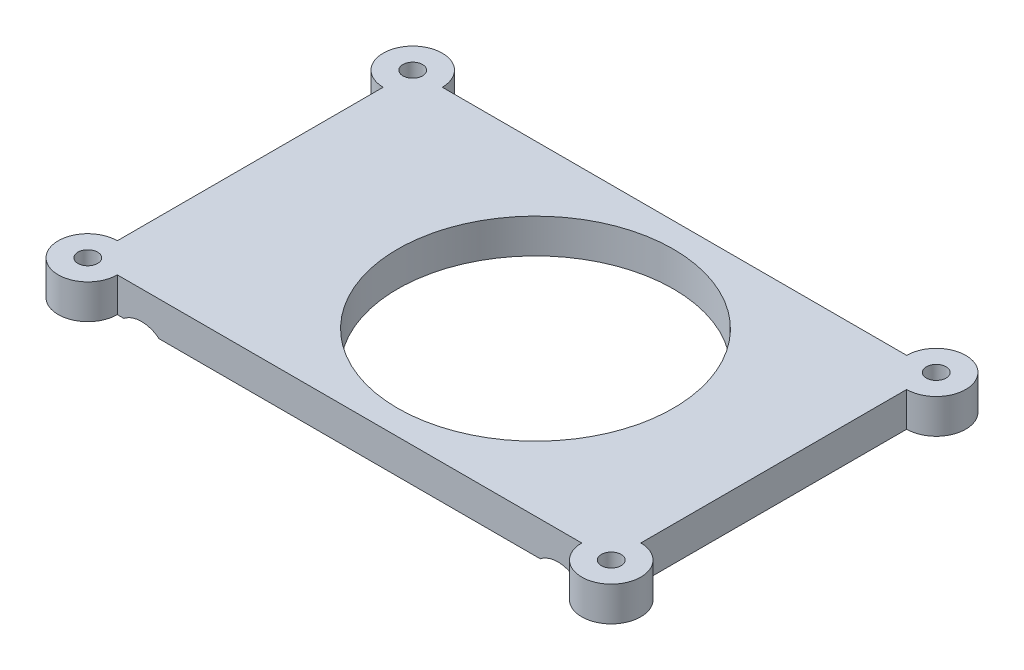
ISO-10303-21;
HEADER;
FILE_DESCRIPTION(('STEP AP214'),'2;1');
FILE_NAME('part.step','',(''),(''),'','','');
FILE_SCHEMA(('AUTOMOTIVE_DESIGN { 1 0 10303 214 1 1 1 1 }'));
ENDSEC;
DATA;
#1=APPLICATION_CONTEXT('core data for automotive mechanical design processes');
#2=APPLICATION_PROTOCOL_DEFINITION('international standard','automotive_design',2000,#1);
#3=PRODUCT_CONTEXT('',#1,'mechanical');
#4=PRODUCT('Part','Part','',(#3));
#5=PRODUCT_RELATED_PRODUCT_CATEGORY('part','',(#4));
#6=PRODUCT_DEFINITION_FORMATION('','',#4);
#7=PRODUCT_DEFINITION_CONTEXT('part definition',#1,'design');
#8=PRODUCT_DEFINITION('design','',#6,#7);
#9=PRODUCT_DEFINITION_SHAPE('','',#8);
#10=(LENGTH_UNIT() NAMED_UNIT(*) SI_UNIT(.MILLI.,.METRE.));
#11=(NAMED_UNIT(*) PLANE_ANGLE_UNIT() SI_UNIT($,.RADIAN.));
#12=(NAMED_UNIT(*) SI_UNIT($,.STERADIAN.) SOLID_ANGLE_UNIT());
#13=UNCERTAINTY_MEASURE_WITH_UNIT(LENGTH_MEASURE(1.E-05),#10,'distance_accuracy_value','');
#14=(GEOMETRIC_REPRESENTATION_CONTEXT(3) GLOBAL_UNCERTAINTY_ASSIGNED_CONTEXT((#13)) GLOBAL_UNIT_ASSIGNED_CONTEXT((#10,
#11,#12)) REPRESENTATION_CONTEXT('',''));
#15=CARTESIAN_POINT('',(0.,0.,0.));
#16=DIRECTION('',(0.,0.,1.));
#17=DIRECTION('',(1.,0.,0.));
#18=AXIS2_PLACEMENT_3D('',#15,#16,#17);
#19=CARTESIAN_POINT('',(0.,10.,33.));
#20=DIRECTION('',(0.,0.,1.));
#21=DIRECTION('',(1.,0.,0.));
#22=AXIS2_PLACEMENT_3D('',#19,#20,#21);
#23=PLANE('',#22);
#24=DIRECTION('',(0.,-1.,0.));
#25=VECTOR('',#24,1.);
#26=CARTESIAN_POINT('',(47.16,26.9705627484772,33.));
#27=LINE('',#26,#25);
#28=CARTESIAN_POINT('',(47.16,7.,33.));
#29=VERTEX_POINT('',#28);
#30=CARTESIAN_POINT('',(47.16,0.,33.));
#31=VERTEX_POINT('',#30);
#32=EDGE_CURVE('E224',#29,#31,#27,.T.);
#33=ORIENTED_EDGE('',*,*,#32,.F.);
#34=DIRECTION('',(1.,0.,0.));
#35=VECTOR('',#34,1.);
#36=CARTESIAN_POINT('',(-47.16,7.,33.));
#37=LINE('',#36,#35);
#38=CARTESIAN_POINT('',(-47.16,7.,33.));
#39=VERTEX_POINT('',#38);
#40=EDGE_CURVE('E380',#39,#29,#37,.T.);
#41=ORIENTED_EDGE('',*,*,#40,.F.);
#42=DIRECTION('',(0.,-1.,0.));
#43=VECTOR('',#42,1.);
#44=CARTESIAN_POINT('',(-47.16,26.9705627484772,33.));
#45=LINE('',#44,#43);
#46=CARTESIAN_POINT('',(-47.16,0.,33.));
#47=VERTEX_POINT('',#46);
#48=EDGE_CURVE('E201',#39,#47,#45,.T.);
#49=ORIENTED_EDGE('',*,*,#48,.T.);
#50=DIRECTION('',(-1.,0.,0.));
#51=VECTOR('',#50,1.);
#52=CARTESIAN_POINT('',(0.,0.,33.));
#53=LINE('',#52,#51);
#54=CARTESIAN_POINT('',(-45.8294552658191,0.,33.));
#55=VERTEX_POINT('',#54);
#56=EDGE_CURVE('E271',#55,#47,#53,.T.);
#57=ORIENTED_EDGE('',*,*,#56,.F.);
#58=CARTESIAN_POINT('',(-42.25,-4.5,33.));
#59=DIRECTION('',(0.,0.,1.));
#60=DIRECTION('',(1.,0.,0.));
#61=AXIS2_PLACEMENT_3D('',#58,#59,#60);
#62=CIRCLE('',#61,5.75);
#63=CARTESIAN_POINT('',(-38.6705447341809,0.,33.));
#64=VERTEX_POINT('',#63);
#65=EDGE_CURVE('E220',#64,#55,#62,.T.);
#66=ORIENTED_EDGE('',*,*,#65,.F.);
#67=CARTESIAN_POINT('',(38.7305447341809,0.,33.));
#68=VERTEX_POINT('',#67);
#69=EDGE_CURVE('E275',#68,#64,#53,.T.);
#70=ORIENTED_EDGE('',*,*,#69,.F.);
#71=CARTESIAN_POINT('',(42.31,-4.5,33.));
#72=DIRECTION('',(0.,0.,1.));
#73=DIRECTION('',(1.,0.,0.));
#74=AXIS2_PLACEMENT_3D('',#71,#72,#73);
#75=CIRCLE('',#74,5.75);
#76=CARTESIAN_POINT('',(45.8894552658191,0.,33.));
#77=VERTEX_POINT('',#76);
#78=EDGE_CURVE('E242',#77,#68,#75,.T.);
#79=ORIENTED_EDGE('',*,*,#78,.F.);
#80=EDGE_CURVE('E272',#31,#77,#53,.T.);
#81=ORIENTED_EDGE('',*,*,#80,.F.);
#82=EDGE_LOOP('',(#33,#41,#49,#57,#66,#70,#79,#81));
#83=FACE_BOUND('',#82,.T.);
#84=ADVANCED_FACE('F37',(#83),#23,.T.);
#85=CARTESIAN_POINT('',(53.16,10.,0.));
#86=DIRECTION('',(-1.,0.,0.));
#87=DIRECTION('',(0.,0.,1.));
#88=AXIS2_PLACEMENT_3D('',#85,#86,#87);
#89=PLANE('',#88);
#90=DIRECTION('',(0.,0.,-1.));
#91=VECTOR('',#90,1.);
#92=CARTESIAN_POINT('',(53.16,7.,27.));
#93=LINE('',#92,#91);
#94=CARTESIAN_POINT('',(53.16,7.,27.));
#95=VERTEX_POINT('',#94);
#96=CARTESIAN_POINT('',(53.16,7.,-27.));
#97=VERTEX_POINT('',#96);
#98=EDGE_CURVE('E379',#95,#97,#93,.T.);
#99=ORIENTED_EDGE('',*,*,#98,.F.);
#100=DIRECTION('',(0.,-1.,0.));
#101=VECTOR('',#100,1.);
#102=CARTESIAN_POINT('',(53.16,26.9705627484772,27.));
#103=LINE('',#102,#101);
#104=CARTESIAN_POINT('',(53.16,0.,27.));
#105=VERTEX_POINT('',#104);
#106=EDGE_CURVE('E221',#95,#105,#103,.T.);
#107=ORIENTED_EDGE('',*,*,#106,.T.);
#108=DIRECTION('',(0.,0.,-1.));
#109=VECTOR('',#108,1.);
#110=CARTESIAN_POINT('',(53.16,0.,0.));
#111=LINE('',#110,#109);
#112=CARTESIAN_POINT('',(53.16,0.,-27.));
#113=VERTEX_POINT('',#112);
#114=EDGE_CURVE('E274',#105,#113,#111,.T.);
#115=ORIENTED_EDGE('',*,*,#114,.T.);
#116=DIRECTION('',(0.,-1.,0.));
#117=VECTOR('',#116,1.);
#118=CARTESIAN_POINT('',(53.16,26.9705627484772,-27.));
#119=LINE('',#118,#117);
#120=EDGE_CURVE('E214',#97,#113,#119,.T.);
#121=ORIENTED_EDGE('',*,*,#120,.F.);
#122=EDGE_LOOP('',(#99,#107,#115,#121));
#123=FACE_BOUND('',#122,.T.);
#124=ADVANCED_FACE('F373',(#123),#89,.F.);
#125=CARTESIAN_POINT('',(0.,10.,-33.));
#126=DIRECTION('',(0.,0.,1.));
#127=DIRECTION('',(1.,0.,0.));
#128=AXIS2_PLACEMENT_3D('',#125,#126,#127);
#129=PLANE('',#128);
#130=DIRECTION('',(-1.,0.,0.));
#131=VECTOR('',#130,1.);
#132=CARTESIAN_POINT('',(47.16,7.,-33.));
#133=LINE('',#132,#131);
#134=CARTESIAN_POINT('',(47.16,7.,-33.));
#135=VERTEX_POINT('',#134);
#136=CARTESIAN_POINT('',(-47.16,7.,-33.));
#137=VERTEX_POINT('',#136);
#138=EDGE_CURVE('E52',#135,#137,#133,.T.);
#139=ORIENTED_EDGE('',*,*,#138,.F.);
#140=DIRECTION('',(0.,-1.,0.));
#141=VECTOR('',#140,1.);
#142=CARTESIAN_POINT('',(47.16,26.9705627484772,-33.));
#143=LINE('',#142,#141);
#144=CARTESIAN_POINT('',(47.16,0.,-33.));
#145=VERTEX_POINT('',#144);
#146=EDGE_CURVE('E211',#135,#145,#143,.T.);
#147=ORIENTED_EDGE('',*,*,#146,.T.);
#148=DIRECTION('',(-1.,0.,0.));
#149=VECTOR('',#148,1.);
#150=CARTESIAN_POINT('',(0.,0.,-33.));
#151=LINE('',#150,#149);
#152=CARTESIAN_POINT('',(45.8894552658191,0.,-33.));
#153=VERTEX_POINT('',#152);
#154=EDGE_CURVE('E279',#145,#153,#151,.T.);
#155=ORIENTED_EDGE('',*,*,#154,.T.);
#156=CARTESIAN_POINT('',(42.31,-4.5,-33.));
#157=DIRECTION('',(0.,0.,1.));
#158=DIRECTION('',(1.,0.,0.));
#159=AXIS2_PLACEMENT_3D('',#156,#157,#158);
#160=CIRCLE('',#159,5.75);
#161=CARTESIAN_POINT('',(38.7305447341809,0.,-33.));
#162=VERTEX_POINT('',#161);
#163=EDGE_CURVE('E245',#153,#162,#160,.T.);
#164=ORIENTED_EDGE('',*,*,#163,.T.);
#165=CARTESIAN_POINT('',(-38.6705447341809,0.,-33.));
#166=VERTEX_POINT('',#165);
#167=EDGE_CURVE('E282',#162,#166,#151,.T.);
#168=ORIENTED_EDGE('',*,*,#167,.T.);
#169=CARTESIAN_POINT('',(-42.25,-4.5,-33.));
#170=DIRECTION('',(0.,0.,1.));
#171=DIRECTION('',(1.,0.,0.));
#172=AXIS2_PLACEMENT_3D('',#169,#170,#171);
#173=CIRCLE('',#172,5.75);
#174=CARTESIAN_POINT('',(-45.8294552658191,0.,-33.));
#175=VERTEX_POINT('',#174);
#176=EDGE_CURVE('E228',#166,#175,#173,.T.);
#177=ORIENTED_EDGE('',*,*,#176,.T.);
#178=CARTESIAN_POINT('',(-47.16,0.,-33.));
#179=VERTEX_POINT('',#178);
#180=EDGE_CURVE('E278',#175,#179,#151,.T.);
#181=ORIENTED_EDGE('',*,*,#180,.T.);
#182=DIRECTION('',(0.,-1.,0.));
#183=VECTOR('',#182,1.);
#184=CARTESIAN_POINT('',(-47.16,26.9705627484772,-33.));
#185=LINE('',#184,#183);
#186=EDGE_CURVE('E189',#137,#179,#185,.T.);
#187=ORIENTED_EDGE('',*,*,#186,.F.);
#188=EDGE_LOOP('',(#139,#147,#155,#164,#168,#177,#181,#187));
#189=FACE_BOUND('',#188,.T.);
#190=ADVANCED_FACE('F362',(#189),#129,.F.);
#191=CARTESIAN_POINT('',(-53.16,10.,0.));
#192=DIRECTION('',(-1.,0.,0.));
#193=DIRECTION('',(0.,0.,1.));
#194=AXIS2_PLACEMENT_3D('',#191,#192,#193);
#195=PLANE('',#194);
#196=DIRECTION('',(0.,-1.,0.));
#197=VECTOR('',#196,1.);
#198=CARTESIAN_POINT('',(-53.16,26.9705627484772,27.));
#199=LINE('',#198,#197);
#200=CARTESIAN_POINT('',(-53.16,7.,27.));
#201=VERTEX_POINT('',#200);
#202=CARTESIAN_POINT('',(-53.16,0.,27.));
#203=VERTEX_POINT('',#202);
#204=EDGE_CURVE('E182',#201,#203,#199,.T.);
#205=ORIENTED_EDGE('',*,*,#204,.F.);
#206=DIRECTION('',(0.,0.,1.));
#207=VECTOR('',#206,1.);
#208=CARTESIAN_POINT('',(-53.16,7.,-27.));
#209=LINE('',#208,#207);
#210=CARTESIAN_POINT('',(-53.16,7.,-27.));
#211=VERTEX_POINT('',#210);
#212=EDGE_CURVE('E175',#211,#201,#209,.T.);
#213=ORIENTED_EDGE('',*,*,#212,.F.);
#214=DIRECTION('',(0.,-1.,0.));
#215=VECTOR('',#214,1.);
#216=CARTESIAN_POINT('',(-53.16,26.9705627484772,-27.));
#217=LINE('',#216,#215);
#218=CARTESIAN_POINT('',(-53.16,0.,-27.));
#219=VERTEX_POINT('',#218);
#220=EDGE_CURVE('E60',#211,#219,#217,.T.);
#221=ORIENTED_EDGE('',*,*,#220,.T.);
#222=DIRECTION('',(0.,0.,-1.));
#223=VECTOR('',#222,1.);
#224=CARTESIAN_POINT('',(-53.16,0.,0.));
#225=LINE('',#224,#223);
#226=EDGE_CURVE('E281',#203,#219,#225,.T.);
#227=ORIENTED_EDGE('',*,*,#226,.F.);
#228=EDGE_LOOP('',(#205,#213,#221,#227));
#229=FACE_BOUND('',#228,.T.);
#230=ADVANCED_FACE('F181',(#229),#195,.T.);
#231=CARTESIAN_POINT('',(53.16,26.9705627484772,33.));
#232=DIRECTION('',(0.,-1.,0.));
#233=DIRECTION('',(0.,0.,-1.));
#234=AXIS2_PLACEMENT_3D('',#231,#232,#233);
#235=CYLINDRICAL_SURFACE('',#234,2.);
#236=CARTESIAN_POINT('',(53.16,0.,33.));
#237=DIRECTION('',(0.,-1.,0.));
#238=DIRECTION('',(0.,0.,-1.));
#239=AXIS2_PLACEMENT_3D('',#236,#237,#238);
#240=CIRCLE('',#239,2.);
#241=CARTESIAN_POINT('',(53.16,0.,31.));
#242=VERTEX_POINT('',#241);
#243=EDGE_CURVE('E210',#242,#242,#240,.T.);
#244=ORIENTED_EDGE('',*,*,#243,.T.);
#245=EDGE_LOOP('',(#244));
#246=FACE_BOUND('',#245,.T.);
#247=CARTESIAN_POINT('',(53.16,7.,33.));
#248=DIRECTION('',(0.,1.,0.));
#249=DIRECTION('',(0.,0.,1.));
#250=AXIS2_PLACEMENT_3D('',#247,#248,#249);
#251=CIRCLE('',#250,2.);
#252=CARTESIAN_POINT('',(53.16,7.,35.));
#253=VERTEX_POINT('',#252);
#254=EDGE_CURVE('E397',#253,#253,#251,.F.);
#255=ORIENTED_EDGE('',*,*,#254,.F.);
#256=EDGE_LOOP('',(#255));
#257=FACE_BOUND('',#256,.T.);
#258=ADVANCED_FACE('F426',(#246,#257),#235,.F.);
#259=CARTESIAN_POINT('',(53.16,26.9705627484772,33.));
#260=DIRECTION('',(0.,-1.,0.));
#261=DIRECTION('',(0.,0.,-1.));
#262=AXIS2_PLACEMENT_3D('',#259,#260,#261);
#263=CYLINDRICAL_SURFACE('',#262,5.99999999999999);
#264=ORIENTED_EDGE('',*,*,#106,.F.);
#265=CARTESIAN_POINT('',(53.16,7.,33.));
#266=DIRECTION('',(0.,1.,0.));
#267=DIRECTION('',(0.,0.,1.));
#268=AXIS2_PLACEMENT_3D('',#265,#266,#267);
#269=CIRCLE('',#268,6.);
#270=EDGE_CURVE('E378',#29,#95,#269,.T.);
#271=ORIENTED_EDGE('',*,*,#270,.F.);
#272=ORIENTED_EDGE('',*,*,#32,.T.);
#273=CARTESIAN_POINT('',(53.16,0.,33.));
#274=DIRECTION('',(0.,-1.,0.));
#275=DIRECTION('',(0.,0.,-1.));
#276=AXIS2_PLACEMENT_3D('',#273,#274,#275);
#277=CIRCLE('',#276,5.99999999999999);
#278=EDGE_CURVE('E217',#105,#31,#277,.T.);
#279=ORIENTED_EDGE('',*,*,#278,.F.);
#280=EDGE_LOOP('',(#264,#271,#272,#279));
#281=FACE_BOUND('',#280,.T.);
#282=ADVANCED_FACE('F376',(#281),#263,.T.);
#283=CARTESIAN_POINT('',(53.16,26.9705627484772,-33.));
#284=DIRECTION('',(0.,-1.,0.));
#285=DIRECTION('',(0.,0.,-1.));
#286=AXIS2_PLACEMENT_3D('',#283,#284,#285);
#287=CYLINDRICAL_SURFACE('',#286,2.);
#288=CARTESIAN_POINT('',(53.16,0.,-33.));
#289=DIRECTION('',(0.,-1.,0.));
#290=DIRECTION('',(0.,0.,-1.));
#291=AXIS2_PLACEMENT_3D('',#288,#289,#290);
#292=CIRCLE('',#291,2.);
#293=CARTESIAN_POINT('',(53.16,0.,-35.));
#294=VERTEX_POINT('',#293);
#295=EDGE_CURVE('E200',#294,#294,#292,.T.);
#296=ORIENTED_EDGE('',*,*,#295,.T.);
#297=EDGE_LOOP('',(#296));
#298=FACE_BOUND('',#297,.T.);
#299=CARTESIAN_POINT('',(53.16,7.,-33.));
#300=DIRECTION('',(0.,1.,0.));
#301=DIRECTION('',(0.,0.,1.));
#302=AXIS2_PLACEMENT_3D('',#299,#300,#301);
#303=CIRCLE('',#302,2.);
#304=CARTESIAN_POINT('',(53.16,7.,-31.));
#305=VERTEX_POINT('',#304);
#306=EDGE_CURVE('E394',#305,#305,#303,.F.);
#307=ORIENTED_EDGE('',*,*,#306,.F.);
#308=EDGE_LOOP('',(#307));
#309=FACE_BOUND('',#308,.T.);
#310=ADVANCED_FACE('F434',(#298,#309),#287,.F.);
#311=CARTESIAN_POINT('',(53.16,26.9705627484772,-33.));
#312=DIRECTION('',(0.,-1.,0.));
#313=DIRECTION('',(0.,0.,-1.));
#314=AXIS2_PLACEMENT_3D('',#311,#312,#313);
#315=CYLINDRICAL_SURFACE('',#314,6.);
#316=ORIENTED_EDGE('',*,*,#146,.F.);
#317=CARTESIAN_POINT('',(53.16,7.,-33.));
#318=DIRECTION('',(0.,1.,0.));
#319=DIRECTION('',(0.,0.,1.));
#320=AXIS2_PLACEMENT_3D('',#317,#318,#319);
#321=CIRCLE('',#320,6.);
#322=EDGE_CURVE('E370',#97,#135,#321,.T.);
#323=ORIENTED_EDGE('',*,*,#322,.F.);
#324=ORIENTED_EDGE('',*,*,#120,.T.);
#325=CARTESIAN_POINT('',(53.16,0.,-33.));
#326=DIRECTION('',(0.,-1.,0.));
#327=DIRECTION('',(0.,0.,-1.));
#328=AXIS2_PLACEMENT_3D('',#325,#326,#327);
#329=CIRCLE('',#328,6.);
#330=EDGE_CURVE('E207',#145,#113,#329,.T.);
#331=ORIENTED_EDGE('',*,*,#330,.F.);
#332=EDGE_LOOP('',(#316,#323,#324,#331));
#333=FACE_BOUND('',#332,.T.);
#334=ADVANCED_FACE('F367',(#333),#315,.T.);
#335=CARTESIAN_POINT('',(-53.16,26.9705627484772,33.));
#336=DIRECTION('',(0.,-1.,0.));
#337=DIRECTION('',(0.,0.,-1.));
#338=AXIS2_PLACEMENT_3D('',#335,#336,#337);
#339=CYLINDRICAL_SURFACE('',#338,2.);
#340=CARTESIAN_POINT('',(-53.16,0.,33.));
#341=DIRECTION('',(0.,-1.,0.));
#342=DIRECTION('',(0.,0.,-1.));
#343=AXIS2_PLACEMENT_3D('',#340,#341,#342);
#344=CIRCLE('',#343,2.);
#345=CARTESIAN_POINT('',(-53.16,0.,31.));
#346=VERTEX_POINT('',#345);
#347=EDGE_CURVE('E202',#346,#346,#344,.T.);
#348=ORIENTED_EDGE('',*,*,#347,.T.);
#349=EDGE_LOOP('',(#348));
#350=FACE_BOUND('',#349,.T.);
#351=CARTESIAN_POINT('',(-53.16,7.,33.));
#352=DIRECTION('',(0.,1.,0.));
#353=DIRECTION('',(0.,0.,1.));
#354=AXIS2_PLACEMENT_3D('',#351,#352,#353);
#355=CIRCLE('',#354,2.);
#356=CARTESIAN_POINT('',(-53.16,7.,35.));
#357=VERTEX_POINT('',#356);
#358=EDGE_CURVE('E391',#357,#357,#355,.F.);
#359=ORIENTED_EDGE('',*,*,#358,.F.);
#360=EDGE_LOOP('',(#359));
#361=FACE_BOUND('',#360,.T.);
#362=ADVANCED_FACE('F413',(#350,#361),#339,.F.);
#363=CARTESIAN_POINT('',(-53.16,26.9705627484772,33.));
#364=DIRECTION('',(0.,-1.,0.));
#365=DIRECTION('',(0.,0.,-1.));
#366=AXIS2_PLACEMENT_3D('',#363,#364,#365);
#367=CYLINDRICAL_SURFACE('',#366,6.);
#368=ORIENTED_EDGE('',*,*,#48,.F.);
#369=CARTESIAN_POINT('',(-53.16,7.,33.));
#370=DIRECTION('',(0.,1.,0.));
#371=DIRECTION('',(0.,0.,1.));
#372=AXIS2_PLACEMENT_3D('',#369,#370,#371);
#373=CIRCLE('',#372,6.);
#374=EDGE_CURVE('E183',#201,#39,#373,.T.);
#375=ORIENTED_EDGE('',*,*,#374,.F.);
#376=ORIENTED_EDGE('',*,*,#204,.T.);
#377=CARTESIAN_POINT('',(-53.16,0.,33.));
#378=DIRECTION('',(0.,-1.,0.));
#379=DIRECTION('',(0.,0.,-1.));
#380=AXIS2_PLACEMENT_3D('',#377,#378,#379);
#381=CIRCLE('',#380,6.);
#382=EDGE_CURVE('E197',#47,#203,#381,.T.);
#383=ORIENTED_EDGE('',*,*,#382,.F.);
#384=EDGE_LOOP('',(#368,#375,#376,#383));
#385=FACE_BOUND('',#384,.T.);
#386=ADVANCED_FACE('F359',(#385),#367,.T.);
#387=CARTESIAN_POINT('',(-53.16,26.9705627484772,-33.));
#388=DIRECTION('',(0.,-1.,0.));
#389=DIRECTION('',(0.,0.,-1.));
#390=AXIS2_PLACEMENT_3D('',#387,#388,#389);
#391=CYLINDRICAL_SURFACE('',#390,6.);
#392=ORIENTED_EDGE('',*,*,#220,.F.);
#393=CARTESIAN_POINT('',(-53.16,7.,-33.));
#394=DIRECTION('',(0.,1.,0.));
#395=DIRECTION('',(0.,0.,1.));
#396=AXIS2_PLACEMENT_3D('',#393,#394,#395);
#397=CIRCLE('',#396,6.00000000000001);
#398=EDGE_CURVE('E172',#137,#211,#397,.T.);
#399=ORIENTED_EDGE('',*,*,#398,.F.);
#400=ORIENTED_EDGE('',*,*,#186,.T.);
#401=CARTESIAN_POINT('',(-53.16,0.,-33.));
#402=DIRECTION('',(0.,-1.,0.));
#403=DIRECTION('',(0.,0.,-1.));
#404=AXIS2_PLACEMENT_3D('',#401,#402,#403);
#405=CIRCLE('',#404,6.);
#406=EDGE_CURVE('E188',#219,#179,#405,.T.);
#407=ORIENTED_EDGE('',*,*,#406,.F.);
#408=EDGE_LOOP('',(#392,#399,#400,#407));
#409=FACE_BOUND('',#408,.T.);
#410=ADVANCED_FACE('F186',(#409),#391,.T.);
#411=CARTESIAN_POINT('',(-53.16,26.9705627484772,-33.));
#412=DIRECTION('',(0.,-1.,0.));
#413=DIRECTION('',(0.,0.,-1.));
#414=AXIS2_PLACEMENT_3D('',#411,#412,#413);
#415=CYLINDRICAL_SURFACE('',#414,2.);
#416=CARTESIAN_POINT('',(-53.16,0.,-33.));
#417=DIRECTION('',(0.,-1.,0.));
#418=DIRECTION('',(0.,0.,-1.));
#419=AXIS2_PLACEMENT_3D('',#416,#417,#418);
#420=CIRCLE('',#419,2.);
#421=CARTESIAN_POINT('',(-53.16,0.,-35.));
#422=VERTEX_POINT('',#421);
#423=EDGE_CURVE('E191',#422,#422,#420,.T.);
#424=ORIENTED_EDGE('',*,*,#423,.T.);
#425=EDGE_LOOP('',(#424));
#426=FACE_BOUND('',#425,.T.);
#427=CARTESIAN_POINT('',(-53.16,7.,-33.));
#428=DIRECTION('',(0.,1.,0.));
#429=DIRECTION('',(0.,0.,1.));
#430=AXIS2_PLACEMENT_3D('',#427,#428,#429);
#431=CIRCLE('',#430,2.);
#432=CARTESIAN_POINT('',(-53.16,7.,-31.));
#433=VERTEX_POINT('',#432);
#434=EDGE_CURVE('E388',#433,#433,#431,.F.);
#435=ORIENTED_EDGE('',*,*,#434,.F.);
#436=EDGE_LOOP('',(#435));
#437=FACE_BOUND('',#436,.T.);
#438=ADVANCED_FACE('F404',(#426,#437),#415,.F.);
#439=CARTESIAN_POINT('',(4.77,0.,0.));
#440=DIRECTION('',(0.,1.,0.));
#441=DIRECTION('',(0.,0.,1.));
#442=AXIS2_PLACEMENT_3D('',#439,#440,#441);
#443=CYLINDRICAL_SURFACE('',#442,28.);
#444=CARTESIAN_POINT('',(4.77,0.,0.));
#445=DIRECTION('',(0.,1.,0.));
#446=DIRECTION('',(0.,0.,1.));
#447=AXIS2_PLACEMENT_3D('',#444,#445,#446);
#448=CIRCLE('',#447,28.);
#449=CARTESIAN_POINT('',(4.77,0.,28.));
#450=VERTEX_POINT('',#449);
#451=EDGE_CURVE('E193',#450,#450,#448,.T.);
#452=ORIENTED_EDGE('',*,*,#451,.F.);
#453=EDGE_LOOP('',(#452));
#454=FACE_BOUND('',#453,.T.);
#455=CARTESIAN_POINT('',(4.77,7.,0.));
#456=DIRECTION('',(0.,1.,0.));
#457=DIRECTION('',(0.,0.,1.));
#458=AXIS2_PLACEMENT_3D('',#455,#456,#457);
#459=CIRCLE('',#458,28.);
#460=CARTESIAN_POINT('',(4.77,7.,28.));
#461=VERTEX_POINT('',#460);
#462=EDGE_CURVE('E40',#461,#461,#459,.F.);
#463=ORIENTED_EDGE('',*,*,#462,.F.);
#464=EDGE_LOOP('',(#463));
#465=FACE_BOUND('',#464,.T.);
#466=ADVANCED_FACE('F409',(#454,#465),#443,.F.);
#467=CARTESIAN_POINT('',(0.,0.,0.));
#468=DIRECTION('',(0.,1.,0.));
#469=DIRECTION('',(0.,0.,1.));
#470=AXIS2_PLACEMENT_3D('',#467,#468,#469);
#471=PLANE('',#470);
#472=ORIENTED_EDGE('',*,*,#423,.F.);
#473=EDGE_LOOP('',(#472));
#474=FACE_BOUND('',#473,.T.);
#475=ORIENTED_EDGE('',*,*,#347,.F.);
#476=EDGE_LOOP('',(#475));
#477=FACE_BOUND('',#476,.T.);
#478=ORIENTED_EDGE('',*,*,#180,.F.);
#479=DIRECTION('',(0.,0.,1.));
#480=VECTOR('',#479,1.);
#481=CARTESIAN_POINT('',(-45.8294552658191,0.,-33.));
#482=LINE('',#481,#480);
#483=CARTESIAN_POINT('',(-45.8294552658191,0.,-31.));
#484=VERTEX_POINT('',#483);
#485=EDGE_CURVE('E234',#175,#484,#482,.T.);
#486=ORIENTED_EDGE('',*,*,#485,.T.);
#487=DIRECTION('',(1.,0.,0.));
#488=VECTOR('',#487,1.);
#489=CARTESIAN_POINT('',(0.,0.,-31.));
#490=LINE('',#489,#488);
#491=CARTESIAN_POINT('',(-48.4364771881904,0.,-31.));
#492=VERTEX_POINT('',#491);
#493=EDGE_CURVE('E285',#492,#484,#490,.T.);
#494=ORIENTED_EDGE('',*,*,#493,.F.);
#495=DIRECTION('',(0.,0.,1.));
#496=VECTOR('',#495,1.);
#497=CARTESIAN_POINT('',(-48.4364771881904,0.,-54.6374675043084));
#498=LINE('',#497,#496);
#499=CARTESIAN_POINT('',(-48.4364771881904,0.,31.));
#500=VERTEX_POINT('',#499);
#501=EDGE_CURVE('E291',#492,#500,#498,.T.);
#502=ORIENTED_EDGE('',*,*,#501,.T.);
#503=DIRECTION('',(1.,0.,0.));
#504=VECTOR('',#503,1.);
#505=CARTESIAN_POINT('',(0.,0.,31.));
#506=LINE('',#505,#504);
#507=CARTESIAN_POINT('',(-45.8294552658191,0.,31.));
#508=VERTEX_POINT('',#507);
#509=EDGE_CURVE('E295',#500,#508,#506,.T.);
#510=ORIENTED_EDGE('',*,*,#509,.T.);
#511=EDGE_CURVE('E239',#508,#55,#482,.T.);
#512=ORIENTED_EDGE('',*,*,#511,.T.);
#513=ORIENTED_EDGE('',*,*,#56,.T.);
#514=ORIENTED_EDGE('',*,*,#382,.T.);
#515=ORIENTED_EDGE('',*,*,#226,.T.);
#516=ORIENTED_EDGE('',*,*,#406,.T.);
#517=EDGE_LOOP('',(#478,#486,#494,#502,#510,#512,#513,#514,#515,#516));
#518=FACE_BOUND('',#517,.T.);
#519=ADVANCED_FACE('F356',(#474,#477,#518),#471,.F.);
#520=ORIENTED_EDGE('',*,*,#451,.T.);
#521=EDGE_LOOP('',(#520));
#522=FACE_BOUND('',#521,.T.);
#523=ORIENTED_EDGE('',*,*,#69,.T.);
#524=DIRECTION('',(0.,0.,1.));
#525=VECTOR('',#524,1.);
#526=CARTESIAN_POINT('',(-38.6705447341809,0.,-33.));
#527=LINE('',#526,#525);
#528=CARTESIAN_POINT('',(-38.6705447341809,0.,31.));
#529=VERTEX_POINT('',#528);
#530=EDGE_CURVE('E235',#64,#529,#527,.F.);
#531=ORIENTED_EDGE('',*,*,#530,.T.);
#532=CARTESIAN_POINT('',(-36.0635228118096,0.,31.));
#533=VERTEX_POINT('',#532);
#534=EDGE_CURVE('E294',#529,#533,#506,.T.);
#535=ORIENTED_EDGE('',*,*,#534,.T.);
#536=DIRECTION('',(0.,0.,1.));
#537=VECTOR('',#536,1.);
#538=CARTESIAN_POINT('',(-36.0635228118096,0.,-54.6374675043084));
#539=LINE('',#538,#537);
#540=CARTESIAN_POINT('',(-36.0635228118096,0.,-31.));
#541=VERTEX_POINT('',#540);
#542=EDGE_CURVE('E288',#533,#541,#539,.F.);
#543=ORIENTED_EDGE('',*,*,#542,.T.);
#544=CARTESIAN_POINT('',(-38.6705447341809,0.,-31.));
#545=VERTEX_POINT('',#544);
#546=EDGE_CURVE('E284',#545,#541,#490,.T.);
#547=ORIENTED_EDGE('',*,*,#546,.F.);
#548=EDGE_CURVE('E231',#545,#166,#527,.F.);
#549=ORIENTED_EDGE('',*,*,#548,.T.);
#550=ORIENTED_EDGE('',*,*,#167,.F.);
#551=DIRECTION('',(0.,0.,1.));
#552=VECTOR('',#551,1.);
#553=CARTESIAN_POINT('',(38.7305447341809,0.,-33.));
#554=LINE('',#553,#552);
#555=CARTESIAN_POINT('',(38.7305447341809,0.,-31.));
#556=VERTEX_POINT('',#555);
#557=EDGE_CURVE('E251',#162,#556,#554,.T.);
#558=ORIENTED_EDGE('',*,*,#557,.T.);
#559=DIRECTION('',(1.,0.,0.));
#560=VECTOR('',#559,1.);
#561=CARTESIAN_POINT('',(0.,0.,-31.));
#562=LINE('',#561,#560);
#563=CARTESIAN_POINT('',(36.1235228118096,0.,-31.));
#564=VERTEX_POINT('',#563);
#565=EDGE_CURVE('E299',#564,#556,#562,.T.);
#566=ORIENTED_EDGE('',*,*,#565,.F.);
#567=DIRECTION('',(0.,0.,1.));
#568=VECTOR('',#567,1.);
#569=CARTESIAN_POINT('',(36.1235228118096,0.,-54.6374675043084));
#570=LINE('',#569,#568);
#571=CARTESIAN_POINT('',(36.1235228118096,0.,31.));
#572=VERTEX_POINT('',#571);
#573=EDGE_CURVE('E305',#564,#572,#570,.T.);
#574=ORIENTED_EDGE('',*,*,#573,.T.);
#575=DIRECTION('',(1.,0.,0.));
#576=VECTOR('',#575,1.);
#577=CARTESIAN_POINT('',(0.,0.,31.));
#578=LINE('',#577,#576);
#579=CARTESIAN_POINT('',(38.7305447341809,0.,31.));
#580=VERTEX_POINT('',#579);
#581=EDGE_CURVE('E309',#572,#580,#578,.T.);
#582=ORIENTED_EDGE('',*,*,#581,.T.);
#583=EDGE_CURVE('E256',#580,#68,#554,.T.);
#584=ORIENTED_EDGE('',*,*,#583,.T.);
#585=EDGE_LOOP('',(#523,#531,#535,#543,#547,#549,#550,#558,#566,#574,#582,#584));
#586=FACE_BOUND('',#585,.T.);
#587=ADVANCED_FACE('F322',(#522,#586),#471,.F.);
#588=ORIENTED_EDGE('',*,*,#330,.T.);
#589=ORIENTED_EDGE('',*,*,#114,.F.);
#590=ORIENTED_EDGE('',*,*,#278,.T.);
#591=ORIENTED_EDGE('',*,*,#80,.T.);
#592=DIRECTION('',(0.,0.,1.));
#593=VECTOR('',#592,1.);
#594=CARTESIAN_POINT('',(45.8894552658191,0.,-33.));
#595=LINE('',#594,#593);
#596=CARTESIAN_POINT('',(45.8894552658191,0.,31.));
#597=VERTEX_POINT('',#596);
#598=EDGE_CURVE('E252',#77,#597,#595,.F.);
#599=ORIENTED_EDGE('',*,*,#598,.T.);
#600=CARTESIAN_POINT('',(48.4964771881904,0.,31.));
#601=VERTEX_POINT('',#600);
#602=EDGE_CURVE('E308',#597,#601,#578,.T.);
#603=ORIENTED_EDGE('',*,*,#602,.T.);
#604=DIRECTION('',(0.,0.,1.));
#605=VECTOR('',#604,1.);
#606=CARTESIAN_POINT('',(48.4964771881904,0.,-54.6374675043084));
#607=LINE('',#606,#605);
#608=CARTESIAN_POINT('',(48.4964771881904,0.,-31.));
#609=VERTEX_POINT('',#608);
#610=EDGE_CURVE('E302',#601,#609,#607,.F.);
#611=ORIENTED_EDGE('',*,*,#610,.T.);
#612=CARTESIAN_POINT('',(45.8894552658191,0.,-31.));
#613=VERTEX_POINT('',#612);
#614=EDGE_CURVE('E298',#613,#609,#562,.T.);
#615=ORIENTED_EDGE('',*,*,#614,.F.);
#616=EDGE_CURVE('E248',#613,#153,#595,.F.);
#617=ORIENTED_EDGE('',*,*,#616,.T.);
#618=ORIENTED_EDGE('',*,*,#154,.F.);
#619=EDGE_LOOP('',(#588,#589,#590,#591,#599,#603,#611,#615,#617,#618));
#620=FACE_BOUND('',#619,.T.);
#621=ORIENTED_EDGE('',*,*,#295,.F.);
#622=EDGE_LOOP('',(#621));
#623=FACE_BOUND('',#622,.T.);
#624=ORIENTED_EDGE('',*,*,#243,.F.);
#625=EDGE_LOOP('',(#624));
#626=FACE_BOUND('',#625,.T.);
#627=ADVANCED_FACE('F340',(#620,#623,#626),#471,.F.);
#628=CARTESIAN_POINT('',(-42.25,-4.5,-54.6374675043084));
#629=DIRECTION('',(0.,0.,1.));
#630=DIRECTION('',(1.,0.,0.));
#631=AXIS2_PLACEMENT_3D('',#628,#629,#630);
#632=CYLINDRICAL_SURFACE('',#631,7.65);
#633=CARTESIAN_POINT('',(-42.25,-4.5,-31.));
#634=DIRECTION('',(0.,0.,1.));
#635=DIRECTION('',(1.,0.,0.));
#636=AXIS2_PLACEMENT_3D('',#633,#634,#635);
#637=CIRCLE('',#636,7.65);
#638=EDGE_CURVE('E268',#492,#541,#637,.F.);
#639=ORIENTED_EDGE('',*,*,#638,.T.);
#640=ORIENTED_EDGE('',*,*,#542,.F.);
#641=CARTESIAN_POINT('',(-42.25,-4.5,31.));
#642=DIRECTION('',(0.,0.,1.));
#643=DIRECTION('',(1.,0.,0.));
#644=AXIS2_PLACEMENT_3D('',#641,#642,#643);
#645=CIRCLE('',#644,7.65);
#646=EDGE_CURVE('E265',#533,#500,#645,.T.);
#647=ORIENTED_EDGE('',*,*,#646,.T.);
#648=ORIENTED_EDGE('',*,*,#501,.F.);
#649=EDGE_LOOP('',(#639,#640,#647,#648));
#650=FACE_BOUND('',#649,.T.);
#651=ADVANCED_FACE('F450',(#650),#632,.F.);
#652=CARTESIAN_POINT('',(0.,0.,31.));
#653=DIRECTION('',(0.,0.,1.));
#654=DIRECTION('',(1.,0.,0.));
#655=AXIS2_PLACEMENT_3D('',#652,#653,#654);
#656=PLANE('',#655);
#657=ORIENTED_EDGE('',*,*,#534,.F.);
#658=CARTESIAN_POINT('',(-42.25,-4.5,31.));
#659=DIRECTION('',(0.,0.,1.));
#660=DIRECTION('',(1.,0.,0.));
#661=AXIS2_PLACEMENT_3D('',#658,#659,#660);
#662=CIRCLE('',#661,5.75);
#663=EDGE_CURVE('E238',#529,#508,#662,.T.);
#664=ORIENTED_EDGE('',*,*,#663,.T.);
#665=ORIENTED_EDGE('',*,*,#509,.F.);
#666=ORIENTED_EDGE('',*,*,#646,.F.);
#667=EDGE_LOOP('',(#657,#664,#665,#666));
#668=FACE_BOUND('',#667,.T.);
#669=ADVANCED_FACE('F453',(#668),#656,.F.);
#670=CARTESIAN_POINT('',(0.,10.,-31.));
#671=DIRECTION('',(0.,0.,1.));
#672=DIRECTION('',(1.,0.,0.));
#673=AXIS2_PLACEMENT_3D('',#670,#671,#672);
#674=PLANE('',#673);
#675=CARTESIAN_POINT('',(-42.25,-4.5,-31.));
#676=DIRECTION('',(0.,0.,1.));
#677=DIRECTION('',(1.,0.,0.));
#678=AXIS2_PLACEMENT_3D('',#675,#676,#677);
#679=CIRCLE('',#678,5.75);
#680=EDGE_CURVE('E12',#545,#484,#679,.T.);
#681=ORIENTED_EDGE('',*,*,#680,.F.);
#682=ORIENTED_EDGE('',*,*,#546,.T.);
#683=ORIENTED_EDGE('',*,*,#638,.F.);
#684=ORIENTED_EDGE('',*,*,#493,.T.);
#685=EDGE_LOOP('',(#681,#682,#683,#684));
#686=FACE_BOUND('',#685,.T.);
#687=ADVANCED_FACE('F457',(#686),#674,.T.);
#688=CARTESIAN_POINT('',(42.31,-4.5,-54.6374675043084));
#689=DIRECTION('',(0.,0.,1.));
#690=DIRECTION('',(1.,0.,0.));
#691=AXIS2_PLACEMENT_3D('',#688,#689,#690);
#692=CYLINDRICAL_SURFACE('',#691,7.65);
#693=CARTESIAN_POINT('',(42.31,-4.5,-31.));
#694=DIRECTION('',(0.,0.,1.));
#695=DIRECTION('',(1.,0.,0.));
#696=AXIS2_PLACEMENT_3D('',#693,#694,#695);
#697=CIRCLE('',#696,7.65);
#698=EDGE_CURVE('E262',#564,#609,#697,.F.);
#699=ORIENTED_EDGE('',*,*,#698,.T.);
#700=ORIENTED_EDGE('',*,*,#610,.F.);
#701=CARTESIAN_POINT('',(42.31,-4.5,31.));
#702=DIRECTION('',(0.,0.,1.));
#703=DIRECTION('',(1.,0.,0.));
#704=AXIS2_PLACEMENT_3D('',#701,#702,#703);
#705=CIRCLE('',#704,7.65);
#706=EDGE_CURVE('E259',#601,#572,#705,.T.);
#707=ORIENTED_EDGE('',*,*,#706,.T.);
#708=ORIENTED_EDGE('',*,*,#573,.F.);
#709=EDGE_LOOP('',(#699,#700,#707,#708));
#710=FACE_BOUND('',#709,.T.);
#711=ADVANCED_FACE('F328',(#710),#692,.F.);
#712=CARTESIAN_POINT('',(0.,0.,31.));
#713=DIRECTION('',(0.,0.,1.));
#714=DIRECTION('',(1.,0.,0.));
#715=AXIS2_PLACEMENT_3D('',#712,#713,#714);
#716=PLANE('',#715);
#717=ORIENTED_EDGE('',*,*,#602,.F.);
#718=CARTESIAN_POINT('',(42.31,-4.5,31.));
#719=DIRECTION('',(0.,0.,1.));
#720=DIRECTION('',(1.,0.,0.));
#721=AXIS2_PLACEMENT_3D('',#718,#719,#720);
#722=CIRCLE('',#721,5.75);
#723=EDGE_CURVE('E255',#597,#580,#722,.T.);
#724=ORIENTED_EDGE('',*,*,#723,.T.);
#725=ORIENTED_EDGE('',*,*,#581,.F.);
#726=ORIENTED_EDGE('',*,*,#706,.F.);
#727=EDGE_LOOP('',(#717,#724,#725,#726));
#728=FACE_BOUND('',#727,.T.);
#729=ADVANCED_FACE('F333',(#728),#716,.F.);
#730=CARTESIAN_POINT('',(0.,10.,-31.));
#731=DIRECTION('',(0.,0.,1.));
#732=DIRECTION('',(1.,0.,0.));
#733=AXIS2_PLACEMENT_3D('',#730,#731,#732);
#734=PLANE('',#733);
#735=CARTESIAN_POINT('',(42.31,-4.5,-31.));
#736=DIRECTION('',(0.,0.,1.));
#737=DIRECTION('',(1.,0.,0.));
#738=AXIS2_PLACEMENT_3D('',#735,#736,#737);
#739=CIRCLE('',#738,5.75);
#740=EDGE_CURVE('E45',#613,#556,#739,.T.);
#741=ORIENTED_EDGE('',*,*,#740,.F.);
#742=ORIENTED_EDGE('',*,*,#614,.T.);
#743=ORIENTED_EDGE('',*,*,#698,.F.);
#744=ORIENTED_EDGE('',*,*,#565,.T.);
#745=EDGE_LOOP('',(#741,#742,#743,#744));
#746=FACE_BOUND('',#745,.T.);
#747=ADVANCED_FACE('F324',(#746),#734,.T.);
#748=CARTESIAN_POINT('',(42.31,-4.5,-33.));
#749=DIRECTION('',(0.,0.,1.));
#750=DIRECTION('',(1.,0.,0.));
#751=AXIS2_PLACEMENT_3D('',#748,#749,#750);
#752=CYLINDRICAL_SURFACE('',#751,5.75);
#753=ORIENTED_EDGE('',*,*,#163,.F.);
#754=ORIENTED_EDGE('',*,*,#616,.F.);
#755=ORIENTED_EDGE('',*,*,#740,.T.);
#756=ORIENTED_EDGE('',*,*,#557,.F.);
#757=EDGE_LOOP('',(#753,#754,#755,#756));
#758=FACE_BOUND('',#757,.T.);
#759=ADVANCED_FACE('F316',(#758),#752,.F.);
#760=ORIENTED_EDGE('',*,*,#723,.F.);
#761=ORIENTED_EDGE('',*,*,#598,.F.);
#762=ORIENTED_EDGE('',*,*,#78,.T.);
#763=ORIENTED_EDGE('',*,*,#583,.F.);
#764=EDGE_LOOP('',(#760,#761,#762,#763));
#765=FACE_BOUND('',#764,.T.);
#766=ADVANCED_FACE('F337',(#765),#752,.F.);
#767=CARTESIAN_POINT('',(-42.25,-4.5,-33.));
#768=DIRECTION('',(0.,0.,1.));
#769=DIRECTION('',(1.,0.,0.));
#770=AXIS2_PLACEMENT_3D('',#767,#768,#769);
#771=CYLINDRICAL_SURFACE('',#770,5.75);
#772=ORIENTED_EDGE('',*,*,#176,.F.);
#773=ORIENTED_EDGE('',*,*,#548,.F.);
#774=ORIENTED_EDGE('',*,*,#680,.T.);
#775=ORIENTED_EDGE('',*,*,#485,.F.);
#776=EDGE_LOOP('',(#772,#773,#774,#775));
#777=FACE_BOUND('',#776,.T.);
#778=ADVANCED_FACE('F469',(#777),#771,.F.);
#779=ORIENTED_EDGE('',*,*,#663,.F.);
#780=ORIENTED_EDGE('',*,*,#530,.F.);
#781=ORIENTED_EDGE('',*,*,#65,.T.);
#782=ORIENTED_EDGE('',*,*,#511,.F.);
#783=EDGE_LOOP('',(#779,#780,#781,#782));
#784=FACE_BOUND('',#783,.T.);
#785=ADVANCED_FACE('F421',(#784),#771,.F.);
#786=CARTESIAN_POINT('',(-53.16,7.,-33.));
#787=DIRECTION('',(0.,1.,0.));
#788=DIRECTION('',(0.,0.,1.));
#789=AXIS2_PLACEMENT_3D('',#786,#787,#788);
#790=PLANE('',#789);
#791=ORIENTED_EDGE('',*,*,#306,.T.);
#792=EDGE_LOOP('',(#791));
#793=FACE_BOUND('',#792,.T.);
#794=ORIENTED_EDGE('',*,*,#434,.T.);
#795=EDGE_LOOP('',(#794));
#796=FACE_BOUND('',#795,.T.);
#797=ORIENTED_EDGE('',*,*,#398,.T.);
#798=ORIENTED_EDGE('',*,*,#212,.T.);
#799=ORIENTED_EDGE('',*,*,#374,.T.);
#800=ORIENTED_EDGE('',*,*,#40,.T.);
#801=ORIENTED_EDGE('',*,*,#270,.T.);
#802=ORIENTED_EDGE('',*,*,#98,.T.);
#803=ORIENTED_EDGE('',*,*,#322,.T.);
#804=ORIENTED_EDGE('',*,*,#138,.T.);
#805=EDGE_LOOP('',(#797,#798,#799,#800,#801,#802,#803,#804));
#806=FACE_BOUND('',#805,.T.);
#807=ORIENTED_EDGE('',*,*,#462,.T.);
#808=EDGE_LOOP('',(#807));
#809=FACE_BOUND('',#808,.T.);
#810=ORIENTED_EDGE('',*,*,#358,.T.);
#811=EDGE_LOOP('',(#810));
#812=FACE_BOUND('',#811,.T.);
#813=ORIENTED_EDGE('',*,*,#254,.T.);
#814=EDGE_LOOP('',(#813));
#815=FACE_BOUND('',#814,.T.);
#816=ADVANCED_FACE('F173',(#793,#796,#806,#809,#812,#815),#790,.T.);
#817=CLOSED_SHELL('',(#84,#124,#190,#230,#258,#282,#310,#334,#362,#386,#410,#438,#466,#519,#587,
#627,#651,#669,#687,#711,#729,#747,#759,#766,#778,#785,#816));
#818=MANIFOLD_SOLID_BREP('B2',#817);
#819=ADVANCED_BREP_SHAPE_REPRESENTATION('',(#18,#818),#14);
#820=SHAPE_DEFINITION_REPRESENTATION(#9,#819);
ENDSEC;
END-ISO-10303-21;
